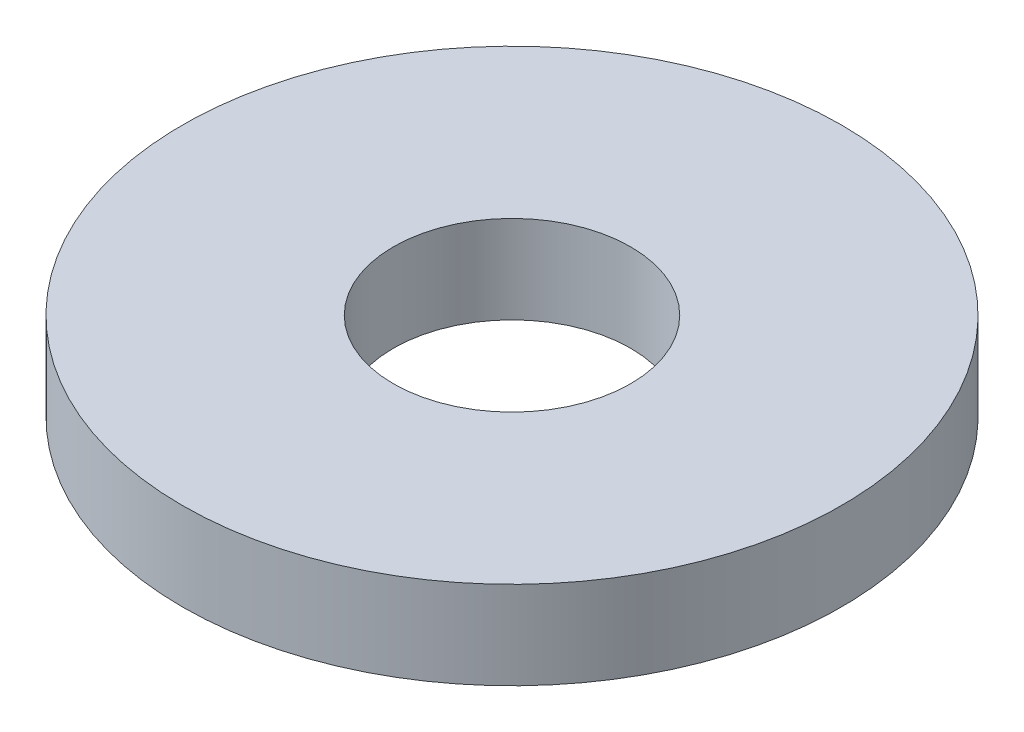
ISO-10303-21;
HEADER;
FILE_DESCRIPTION(('STEP AP214'),'2;1');
FILE_NAME('part.step','',(''),(''),'','','');
FILE_SCHEMA(('AUTOMOTIVE_DESIGN { 1 0 10303 214 1 1 1 1 }'));
ENDSEC;
DATA;
#1=APPLICATION_CONTEXT('core data for automotive mechanical design processes');
#2=APPLICATION_PROTOCOL_DEFINITION('international standard','automotive_design',2000,#1);
#3=PRODUCT_CONTEXT('',#1,'mechanical');
#4=PRODUCT('Part','Part','',(#3));
#5=PRODUCT_RELATED_PRODUCT_CATEGORY('part','',(#4));
#6=PRODUCT_DEFINITION_FORMATION('','',#4);
#7=PRODUCT_DEFINITION_CONTEXT('part definition',#1,'design');
#8=PRODUCT_DEFINITION('design','',#6,#7);
#9=PRODUCT_DEFINITION_SHAPE('','',#8);
#10=(LENGTH_UNIT() NAMED_UNIT(*) SI_UNIT(.MILLI.,.METRE.));
#11=(NAMED_UNIT(*) PLANE_ANGLE_UNIT() SI_UNIT($,.RADIAN.));
#12=(NAMED_UNIT(*) SI_UNIT($,.STERADIAN.) SOLID_ANGLE_UNIT());
#13=UNCERTAINTY_MEASURE_WITH_UNIT(LENGTH_MEASURE(1.E-05),#10,'distance_accuracy_value','');
#14=(GEOMETRIC_REPRESENTATION_CONTEXT(3) GLOBAL_UNCERTAINTY_ASSIGNED_CONTEXT((#13)) GLOBAL_UNIT_ASSIGNED_CONTEXT((#10,
#11,#12)) REPRESENTATION_CONTEXT('',''));
#15=CARTESIAN_POINT('',(0.,0.,0.));
#16=DIRECTION('',(0.,0.,1.));
#17=DIRECTION('',(1.,0.,0.));
#18=AXIS2_PLACEMENT_3D('',#15,#16,#17);
#19=CARTESIAN_POINT('',(0.,2.,0.));
#20=DIRECTION('',(0.,1.,0.));
#21=DIRECTION('',(0.,0.,1.));
#22=AXIS2_PLACEMENT_3D('',#19,#20,#21);
#23=PLANE('',#22);
#24=CARTESIAN_POINT('',(0.,2.,0.));
#25=DIRECTION('',(0.,1.,0.));
#26=DIRECTION('',(0.,0.,1.));
#27=AXIS2_PLACEMENT_3D('',#24,#25,#26);
#28=CIRCLE('',#27,7.5);
#29=CARTESIAN_POINT('',(0.,2.,7.5));
#30=VERTEX_POINT('',#29);
#31=EDGE_CURVE('E10',#30,#30,#28,.T.);
#32=ORIENTED_EDGE('',*,*,#31,.T.);
#33=EDGE_LOOP('',(#32));
#34=FACE_BOUND('',#33,.T.);
#35=CARTESIAN_POINT('',(0.,2.,0.));
#36=DIRECTION('',(0.,1.,0.));
#37=DIRECTION('',(0.,0.,1.));
#38=AXIS2_PLACEMENT_3D('',#35,#36,#37);
#39=CIRCLE('',#38,2.7);
#40=CARTESIAN_POINT('',(0.,2.,2.7));
#41=VERTEX_POINT('',#40);
#42=EDGE_CURVE('E41',#41,#41,#39,.T.);
#43=ORIENTED_EDGE('',*,*,#42,.F.);
#44=EDGE_LOOP('',(#43));
#45=FACE_BOUND('',#44,.T.);
#46=ADVANCED_FACE('F30',(#34,#45),#23,.T.);
#47=CARTESIAN_POINT('',(0.,0.,0.));
#48=DIRECTION('',(0.,1.,0.));
#49=DIRECTION('',(0.,0.,1.));
#50=AXIS2_PLACEMENT_3D('',#47,#48,#49);
#51=PLANE('',#50);
#52=CARTESIAN_POINT('',(0.,0.,0.));
#53=DIRECTION('',(0.,1.,0.));
#54=DIRECTION('',(0.,0.,1.));
#55=AXIS2_PLACEMENT_3D('',#52,#53,#54);
#56=CIRCLE('',#55,7.5);
#57=CARTESIAN_POINT('',(0.,0.,7.5));
#58=VERTEX_POINT('',#57);
#59=EDGE_CURVE('E34',#58,#58,#56,.T.);
#60=ORIENTED_EDGE('',*,*,#59,.F.);
#61=EDGE_LOOP('',(#60));
#62=FACE_BOUND('',#61,.T.);
#63=CARTESIAN_POINT('',(0.,0.,0.));
#64=DIRECTION('',(0.,1.,0.));
#65=DIRECTION('',(0.,0.,1.));
#66=AXIS2_PLACEMENT_3D('',#63,#64,#65);
#67=CIRCLE('',#66,2.7);
#68=CARTESIAN_POINT('',(0.,0.,2.7));
#69=VERTEX_POINT('',#68);
#70=EDGE_CURVE('E43',#69,#69,#67,.T.);
#71=ORIENTED_EDGE('',*,*,#70,.T.);
#72=EDGE_LOOP('',(#71));
#73=FACE_BOUND('',#72,.T.);
#74=ADVANCED_FACE('F53',(#62,#73),#51,.F.);
#75=CARTESIAN_POINT('',(0.,2.,0.));
#76=DIRECTION('',(0.,-1.,0.));
#77=DIRECTION('',(0.,0.,-1.));
#78=AXIS2_PLACEMENT_3D('',#75,#76,#77);
#79=CYLINDRICAL_SURFACE('',#78,7.5);
#80=ORIENTED_EDGE('',*,*,#31,.F.);
#81=EDGE_LOOP('',(#80));
#82=FACE_BOUND('',#81,.T.);
#83=ORIENTED_EDGE('',*,*,#59,.T.);
#84=EDGE_LOOP('',(#83));
#85=FACE_BOUND('',#84,.T.);
#86=ADVANCED_FACE('F32',(#82,#85),#79,.T.);
#87=CARTESIAN_POINT('',(0.,2.,0.));
#88=DIRECTION('',(0.,-1.,0.));
#89=DIRECTION('',(0.,0.,-1.));
#90=AXIS2_PLACEMENT_3D('',#87,#88,#89);
#91=CYLINDRICAL_SURFACE('',#90,2.7);
#92=ORIENTED_EDGE('',*,*,#42,.T.);
#93=EDGE_LOOP('',(#92));
#94=FACE_BOUND('',#93,.T.);
#95=ORIENTED_EDGE('',*,*,#70,.F.);
#96=EDGE_LOOP('',(#95));
#97=FACE_BOUND('',#96,.T.);
#98=ADVANCED_FACE('F49',(#94,#97),#91,.F.);
#99=CLOSED_SHELL('',(#46,#74,#86,#98));
#100=MANIFOLD_SOLID_BREP('B2',#99);
#101=ADVANCED_BREP_SHAPE_REPRESENTATION('',(#18,#100),#14);
#102=SHAPE_DEFINITION_REPRESENTATION(#9,#101);
ENDSEC;
END-ISO-10303-21;
